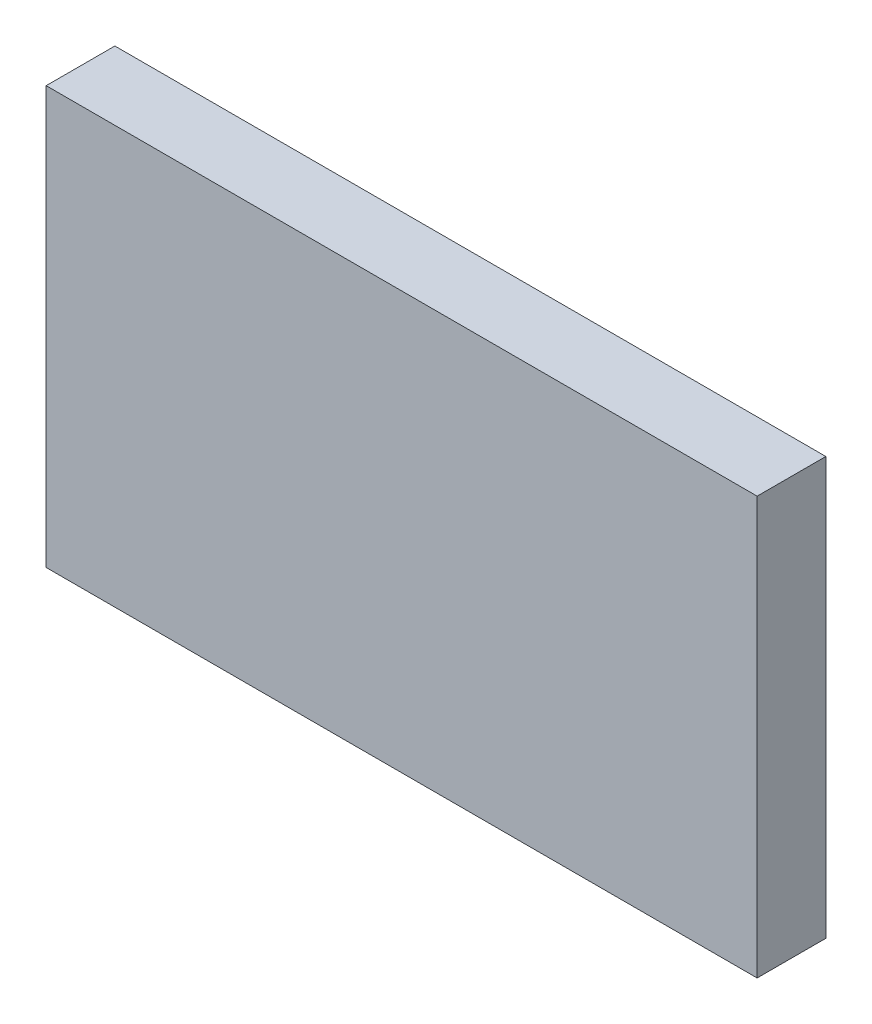
ISO-10303-21;
HEADER;
FILE_DESCRIPTION(('STEP AP214'),'2;1');
FILE_NAME('part.step','',(''),(''),'','','');
FILE_SCHEMA(('AUTOMOTIVE_DESIGN { 1 0 10303 214 1 1 1 1 }'));
ENDSEC;
DATA;
#1=APPLICATION_CONTEXT('core data for automotive mechanical design processes');
#2=APPLICATION_PROTOCOL_DEFINITION('international standard','automotive_design',2000,#1);
#3=PRODUCT_CONTEXT('',#1,'mechanical');
#4=PRODUCT('Part','Part','',(#3));
#5=PRODUCT_RELATED_PRODUCT_CATEGORY('part','',(#4));
#6=PRODUCT_DEFINITION_FORMATION('','',#4);
#7=PRODUCT_DEFINITION_CONTEXT('part definition',#1,'design');
#8=PRODUCT_DEFINITION('design','',#6,#7);
#9=PRODUCT_DEFINITION_SHAPE('','',#8);
#10=(LENGTH_UNIT() NAMED_UNIT(*) SI_UNIT(.MILLI.,.METRE.));
#11=(NAMED_UNIT(*) PLANE_ANGLE_UNIT() SI_UNIT($,.RADIAN.));
#12=(NAMED_UNIT(*) SI_UNIT($,.STERADIAN.) SOLID_ANGLE_UNIT());
#13=UNCERTAINTY_MEASURE_WITH_UNIT(LENGTH_MEASURE(1.E-05),#10,'distance_accuracy_value','');
#14=(GEOMETRIC_REPRESENTATION_CONTEXT(3) GLOBAL_UNCERTAINTY_ASSIGNED_CONTEXT((#13)) GLOBAL_UNIT_ASSIGNED_CONTEXT((#10,
#11,#12)) REPRESENTATION_CONTEXT('',''));
#15=CARTESIAN_POINT('',(0.,0.,0.));
#16=DIRECTION('',(0.,0.,1.));
#17=DIRECTION('',(1.,0.,0.));
#18=AXIS2_PLACEMENT_3D('',#15,#16,#17);
#19=CARTESIAN_POINT('',(0.,0.,-4.));
#20=DIRECTION('',(0.,0.,1.));
#21=DIRECTION('',(1.,0.,0.));
#22=AXIS2_PLACEMENT_3D('',#19,#20,#21);
#23=PLANE('',#22);
#24=DIRECTION('',(0.,1.,0.));
#25=VECTOR('',#24,1.);
#26=CARTESIAN_POINT('',(20.7,12.15,-4.));
#27=LINE('',#26,#25);
#28=CARTESIAN_POINT('',(20.7,-12.15,-4.));
#29=VERTEX_POINT('',#28);
#30=CARTESIAN_POINT('',(20.7,12.15,-4.));
#31=VERTEX_POINT('',#30);
#32=EDGE_CURVE('E129',#29,#31,#27,.T.);
#33=ORIENTED_EDGE('',*,*,#32,.F.);
#34=DIRECTION('',(1.,0.,0.));
#35=VECTOR('',#34,1.);
#36=CARTESIAN_POINT('',(-20.7,-12.15,-4.));
#37=LINE('',#36,#35);
#38=CARTESIAN_POINT('',(-20.7,-12.15,-4.));
#39=VERTEX_POINT('',#38);
#40=EDGE_CURVE('E139',#39,#29,#37,.T.);
#41=ORIENTED_EDGE('',*,*,#40,.F.);
#42=DIRECTION('',(0.,-1.,0.));
#43=VECTOR('',#42,1.);
#44=CARTESIAN_POINT('',(-20.7,12.15,-4.));
#45=LINE('',#44,#43);
#46=CARTESIAN_POINT('',(-20.7,12.15,-4.));
#47=VERTEX_POINT('',#46);
#48=EDGE_CURVE('E136',#47,#39,#45,.T.);
#49=ORIENTED_EDGE('',*,*,#48,.F.);
#50=DIRECTION('',(-1.,0.,0.));
#51=VECTOR('',#50,1.);
#52=CARTESIAN_POINT('',(-20.7,12.15,-4.));
#53=LINE('',#52,#51);
#54=EDGE_CURVE('E132',#31,#47,#53,.T.);
#55=ORIENTED_EDGE('',*,*,#54,.F.);
#56=EDGE_LOOP('',(#33,#41,#49,#55));
#57=FACE_BOUND('',#56,.T.);
#58=DIRECTION('',(0.,-1.,0.));
#59=VECTOR('',#58,1.);
#60=CARTESIAN_POINT('',(12.,-11.7,-4.));
#61=LINE('',#60,#59);
#62=CARTESIAN_POINT('',(12.,-11.4,-4.));
#63=VERTEX_POINT('',#62);
#64=CARTESIAN_POINT('',(12.,-11.7,-4.));
#65=VERTEX_POINT('',#64);
#66=EDGE_CURVE('E119',#63,#65,#61,.T.);
#67=ORIENTED_EDGE('',*,*,#66,.F.);
#68=DIRECTION('',(1.,0.,0.));
#69=VECTOR('',#68,1.);
#70=CARTESIAN_POINT('',(-12.,-11.4,-4.));
#71=LINE('',#70,#69);
#72=CARTESIAN_POINT('',(-12.,-11.4,-4.));
#73=VERTEX_POINT('',#72);
#74=EDGE_CURVE('E116',#73,#63,#71,.T.);
#75=ORIENTED_EDGE('',*,*,#74,.F.);
#76=DIRECTION('',(0.,1.,0.));
#77=VECTOR('',#76,1.);
#78=CARTESIAN_POINT('',(-12.,-11.7,-4.));
#79=LINE('',#78,#77);
#80=CARTESIAN_POINT('',(-12.,-11.7,-4.));
#81=VERTEX_POINT('',#80);
#82=EDGE_CURVE('E55',#81,#73,#79,.T.);
#83=ORIENTED_EDGE('',*,*,#82,.F.);
#84=DIRECTION('',(-1.,0.,0.));
#85=VECTOR('',#84,1.);
#86=CARTESIAN_POINT('',(-12.,-11.7,-4.));
#87=LINE('',#86,#85);
#88=EDGE_CURVE('E50',#65,#81,#87,.T.);
#89=ORIENTED_EDGE('',*,*,#88,.F.);
#90=EDGE_LOOP('',(#67,#75,#83,#89));
#91=FACE_BOUND('',#90,.T.);
#92=ADVANCED_FACE('F33',(#57,#91),#23,.F.);
#93=CARTESIAN_POINT('',(20.7,12.15,-4.));
#94=DIRECTION('',(1.,0.,0.));
#95=DIRECTION('',(0.,0.,-1.));
#96=AXIS2_PLACEMENT_3D('',#93,#94,#95);
#97=PLANE('',#96);
#98=DIRECTION('',(0.,1.,0.));
#99=VECTOR('',#98,1.);
#100=CARTESIAN_POINT('',(20.7,12.15,0.));
#101=LINE('',#100,#99);
#102=CARTESIAN_POINT('',(20.7,-12.15,0.));
#103=VERTEX_POINT('',#102);
#104=CARTESIAN_POINT('',(20.7,12.15,0.));
#105=VERTEX_POINT('',#104);
#106=EDGE_CURVE('E120',#103,#105,#101,.T.);
#107=ORIENTED_EDGE('',*,*,#106,.F.);
#108=DIRECTION('',(0.,0.,1.));
#109=VECTOR('',#108,1.);
#110=CARTESIAN_POINT('',(20.7,-12.15,-4.));
#111=LINE('',#110,#109);
#112=EDGE_CURVE('E11',#29,#103,#111,.T.);
#113=ORIENTED_EDGE('',*,*,#112,.F.);
#114=ORIENTED_EDGE('',*,*,#32,.T.);
#115=DIRECTION('',(0.,0.,1.));
#116=VECTOR('',#115,1.);
#117=CARTESIAN_POINT('',(20.7,12.15,-4.));
#118=LINE('',#117,#116);
#119=EDGE_CURVE('E37',#31,#105,#118,.T.);
#120=ORIENTED_EDGE('',*,*,#119,.T.);
#121=EDGE_LOOP('',(#107,#113,#114,#120));
#122=FACE_BOUND('',#121,.T.);
#123=ADVANCED_FACE('F35',(#122),#97,.T.);
#124=CARTESIAN_POINT('',(-20.7,-12.15,-4.));
#125=DIRECTION('',(0.,-1.,0.));
#126=DIRECTION('',(0.,0.,-1.));
#127=AXIS2_PLACEMENT_3D('',#124,#125,#126);
#128=PLANE('',#127);
#129=DIRECTION('',(1.,0.,0.));
#130=VECTOR('',#129,1.);
#131=CARTESIAN_POINT('',(-20.7,-12.15,0.));
#132=LINE('',#131,#130);
#133=CARTESIAN_POINT('',(-20.7,-12.15,0.));
#134=VERTEX_POINT('',#133);
#135=EDGE_CURVE('E133',#134,#103,#132,.T.);
#136=ORIENTED_EDGE('',*,*,#135,.F.);
#137=DIRECTION('',(0.,0.,1.));
#138=VECTOR('',#137,1.);
#139=CARTESIAN_POINT('',(-20.7,-12.15,-4.));
#140=LINE('',#139,#138);
#141=EDGE_CURVE('E42',#39,#134,#140,.T.);
#142=ORIENTED_EDGE('',*,*,#141,.F.);
#143=ORIENTED_EDGE('',*,*,#40,.T.);
#144=ORIENTED_EDGE('',*,*,#112,.T.);
#145=EDGE_LOOP('',(#136,#142,#143,#144));
#146=FACE_BOUND('',#145,.T.);
#147=ADVANCED_FACE('F162',(#146),#128,.T.);
#148=CARTESIAN_POINT('',(-20.7,12.15,-4.));
#149=DIRECTION('',(-1.,0.,0.));
#150=DIRECTION('',(0.,-1.,0.));
#151=AXIS2_PLACEMENT_3D('',#148,#149,#150);
#152=PLANE('',#151);
#153=DIRECTION('',(0.,-1.,0.));
#154=VECTOR('',#153,1.);
#155=CARTESIAN_POINT('',(-20.7,12.15,0.));
#156=LINE('',#155,#154);
#157=CARTESIAN_POINT('',(-20.7,12.15,0.));
#158=VERTEX_POINT('',#157);
#159=EDGE_CURVE('E144',#158,#134,#156,.T.);
#160=ORIENTED_EDGE('',*,*,#159,.F.);
#161=DIRECTION('',(0.,0.,1.));
#162=VECTOR('',#161,1.);
#163=CARTESIAN_POINT('',(-20.7,12.15,-4.));
#164=LINE('',#163,#162);
#165=EDGE_CURVE('E149',#47,#158,#164,.T.);
#166=ORIENTED_EDGE('',*,*,#165,.F.);
#167=ORIENTED_EDGE('',*,*,#48,.T.);
#168=ORIENTED_EDGE('',*,*,#141,.T.);
#169=EDGE_LOOP('',(#160,#166,#167,#168));
#170=FACE_BOUND('',#169,.T.);
#171=ADVANCED_FACE('F167',(#170),#152,.T.);
#172=CARTESIAN_POINT('',(-20.7,12.15,-4.));
#173=DIRECTION('',(0.,1.,0.));
#174=DIRECTION('',(0.,0.,1.));
#175=AXIS2_PLACEMENT_3D('',#172,#173,#174);
#176=PLANE('',#175);
#177=DIRECTION('',(-1.,0.,0.));
#178=VECTOR('',#177,1.);
#179=CARTESIAN_POINT('',(-20.7,12.15,0.));
#180=LINE('',#179,#178);
#181=EDGE_CURVE('E123',#105,#158,#180,.T.);
#182=ORIENTED_EDGE('',*,*,#181,.F.);
#183=ORIENTED_EDGE('',*,*,#119,.F.);
#184=ORIENTED_EDGE('',*,*,#54,.T.);
#185=ORIENTED_EDGE('',*,*,#165,.T.);
#186=EDGE_LOOP('',(#182,#183,#184,#185));
#187=FACE_BOUND('',#186,.T.);
#188=ADVANCED_FACE('F157',(#187),#176,.T.);
#189=CARTESIAN_POINT('',(0.,0.,0.));
#190=DIRECTION('',(0.,0.,1.));
#191=DIRECTION('',(1.,0.,0.));
#192=AXIS2_PLACEMENT_3D('',#189,#190,#191);
#193=PLANE('',#192);
#194=ORIENTED_EDGE('',*,*,#106,.T.);
#195=ORIENTED_EDGE('',*,*,#181,.T.);
#196=ORIENTED_EDGE('',*,*,#159,.T.);
#197=ORIENTED_EDGE('',*,*,#135,.T.);
#198=EDGE_LOOP('',(#194,#195,#196,#197));
#199=FACE_BOUND('',#198,.T.);
#200=ADVANCED_FACE('F159',(#199),#193,.T.);
#201=CARTESIAN_POINT('',(12.,-11.7,-7.));
#202=DIRECTION('',(-1.,0.,0.));
#203=DIRECTION('',(0.,-1.,0.));
#204=AXIS2_PLACEMENT_3D('',#201,#202,#203);
#205=PLANE('',#204);
#206=ORIENTED_EDGE('',*,*,#66,.T.);
#207=DIRECTION('',(0.,0.,1.));
#208=VECTOR('',#207,1.);
#209=CARTESIAN_POINT('',(12.,-11.7,-7.));
#210=LINE('',#209,#208);
#211=CARTESIAN_POINT('',(12.,-11.7,-7.));
#212=VERTEX_POINT('',#211);
#213=EDGE_CURVE('E100',#212,#65,#210,.T.);
#214=ORIENTED_EDGE('',*,*,#213,.F.);
#215=DIRECTION('',(0.,-1.,0.));
#216=VECTOR('',#215,1.);
#217=CARTESIAN_POINT('',(12.,-11.7,-7.));
#218=LINE('',#217,#216);
#219=CARTESIAN_POINT('',(12.,-11.4,-7.));
#220=VERTEX_POINT('',#219);
#221=EDGE_CURVE('E107',#220,#212,#218,.T.);
#222=ORIENTED_EDGE('',*,*,#221,.F.);
#223=DIRECTION('',(0.,0.,1.));
#224=VECTOR('',#223,1.);
#225=CARTESIAN_POINT('',(12.,-11.4,-7.));
#226=LINE('',#225,#224);
#227=EDGE_CURVE('E260',#220,#63,#226,.T.);
#228=ORIENTED_EDGE('',*,*,#227,.T.);
#229=EDGE_LOOP('',(#206,#214,#222,#228));
#230=FACE_BOUND('',#229,.T.);
#231=ADVANCED_FACE('F118',(#230),#205,.F.);
#232=CARTESIAN_POINT('',(-12.,-11.7,-7.));
#233=DIRECTION('',(0.,1.,0.));
#234=DIRECTION('',(-1.,0.,0.));
#235=AXIS2_PLACEMENT_3D('',#232,#233,#234);
#236=PLANE('',#235);
#237=ORIENTED_EDGE('',*,*,#88,.T.);
#238=DIRECTION('',(0.,0.,1.));
#239=VECTOR('',#238,1.);
#240=CARTESIAN_POINT('',(-12.,-11.7,-7.));
#241=LINE('',#240,#239);
#242=CARTESIAN_POINT('',(-12.,-11.7,-7.));
#243=VERTEX_POINT('',#242);
#244=EDGE_CURVE('E103',#243,#81,#241,.T.);
#245=ORIENTED_EDGE('',*,*,#244,.F.);
#246=DIRECTION('',(-1.,0.,0.));
#247=VECTOR('',#246,1.);
#248=CARTESIAN_POINT('',(-12.,-11.7,-7.));
#249=LINE('',#248,#247);
#250=EDGE_CURVE('E96',#212,#243,#249,.T.);
#251=ORIENTED_EDGE('',*,*,#250,.F.);
#252=ORIENTED_EDGE('',*,*,#213,.T.);
#253=EDGE_LOOP('',(#237,#245,#251,#252));
#254=FACE_BOUND('',#253,.T.);
#255=ADVANCED_FACE('F98',(#254),#236,.F.);
#256=CARTESIAN_POINT('',(-12.,-11.7,-7.));
#257=DIRECTION('',(1.,0.,0.));
#258=DIRECTION('',(0.,1.,0.));
#259=AXIS2_PLACEMENT_3D('',#256,#257,#258);
#260=PLANE('',#259);
#261=ORIENTED_EDGE('',*,*,#82,.T.);
#262=DIRECTION('',(0.,0.,1.));
#263=VECTOR('',#262,1.);
#264=CARTESIAN_POINT('',(-12.,-11.4,-7.));
#265=LINE('',#264,#263);
#266=CARTESIAN_POINT('',(-12.,-11.4,-7.));
#267=VERTEX_POINT('',#266);
#268=EDGE_CURVE('E125',#267,#73,#265,.T.);
#269=ORIENTED_EDGE('',*,*,#268,.F.);
#270=DIRECTION('',(0.,1.,0.));
#271=VECTOR('',#270,1.);
#272=CARTESIAN_POINT('',(-12.,-11.7,-7.));
#273=LINE('',#272,#271);
#274=EDGE_CURVE('E106',#243,#267,#273,.T.);
#275=ORIENTED_EDGE('',*,*,#274,.F.);
#276=ORIENTED_EDGE('',*,*,#244,.T.);
#277=EDGE_LOOP('',(#261,#269,#275,#276));
#278=FACE_BOUND('',#277,.T.);
#279=ADVANCED_FACE('F190',(#278),#260,.F.);
#280=CARTESIAN_POINT('',(-12.,-11.4,-7.));
#281=DIRECTION('',(0.,-1.,0.));
#282=DIRECTION('',(1.,0.,0.));
#283=AXIS2_PLACEMENT_3D('',#280,#281,#282);
#284=PLANE('',#283);
#285=ORIENTED_EDGE('',*,*,#74,.T.);
#286=ORIENTED_EDGE('',*,*,#227,.F.);
#287=DIRECTION('',(1.,0.,0.));
#288=VECTOR('',#287,1.);
#289=CARTESIAN_POINT('',(-12.,-11.4,-7.));
#290=LINE('',#289,#288);
#291=EDGE_CURVE('E112',#267,#220,#290,.T.);
#292=ORIENTED_EDGE('',*,*,#291,.F.);
#293=ORIENTED_EDGE('',*,*,#268,.T.);
#294=EDGE_LOOP('',(#285,#286,#292,#293));
#295=FACE_BOUND('',#294,.T.);
#296=ADVANCED_FACE('F194',(#295),#284,.F.);
#297=CARTESIAN_POINT('',(0.,0.,-7.));
#298=DIRECTION('',(0.,0.,-1.));
#299=DIRECTION('',(-1.,0.,0.));
#300=AXIS2_PLACEMENT_3D('',#297,#298,#299);
#301=PLANE('',#300);
#302=ORIENTED_EDGE('',*,*,#221,.T.);
#303=ORIENTED_EDGE('',*,*,#250,.T.);
#304=ORIENTED_EDGE('',*,*,#274,.T.);
#305=ORIENTED_EDGE('',*,*,#291,.T.);
#306=EDGE_LOOP('',(#302,#303,#304,#305));
#307=FACE_BOUND('',#306,.T.);
#308=ADVANCED_FACE('F110',(#307),#301,.T.);
#309=CLOSED_SHELL('',(#92,#123,#147,#171,#188,#200,#231,#255,#279,#296,#308));
#310=MANIFOLD_SOLID_BREP('B2',#309);
#311=ADVANCED_BREP_SHAPE_REPRESENTATION('',(#18,#310),#14);
#312=SHAPE_DEFINITION_REPRESENTATION(#9,#311);
ENDSEC;
END-ISO-10303-21;
